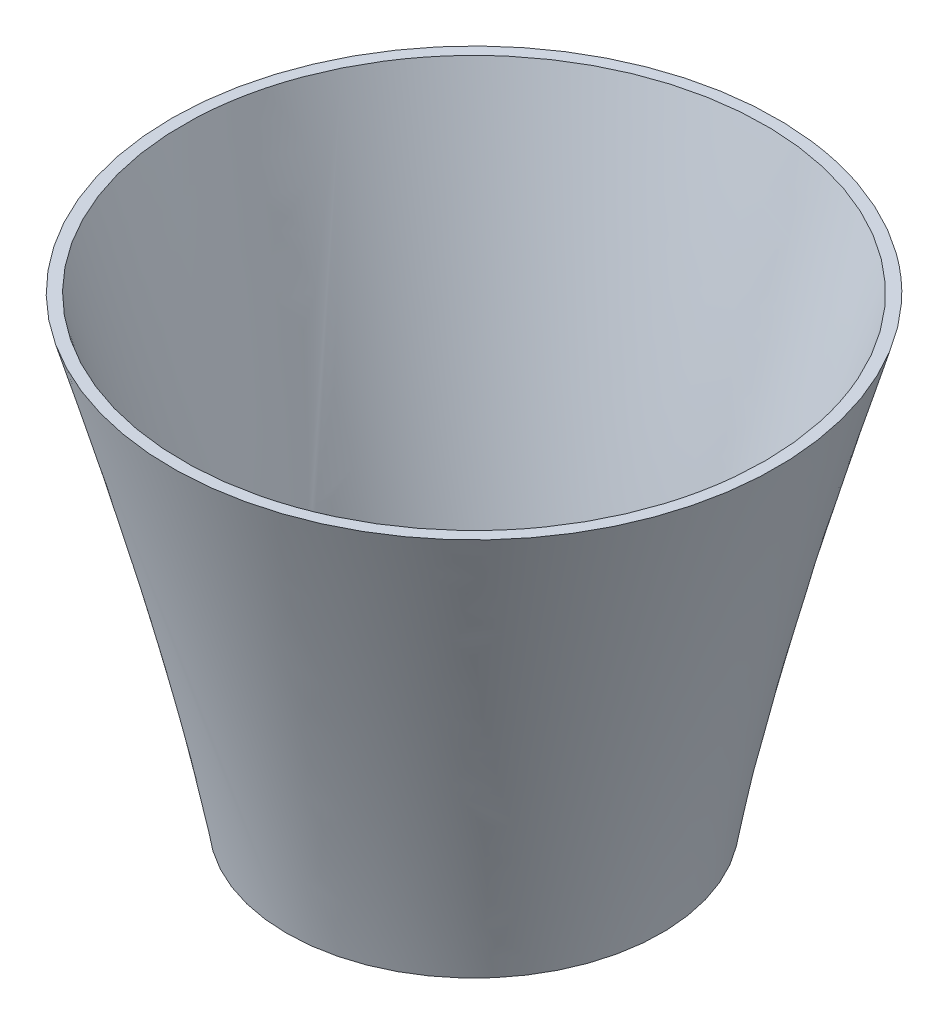
ISO-10303-21;
HEADER;
FILE_DESCRIPTION(('STEP AP214'),'2;1');
FILE_NAME('part.step','',(''),(''),'','','');
FILE_SCHEMA(('AUTOMOTIVE_DESIGN { 1 0 10303 214 1 1 1 1 }'));
ENDSEC;
DATA;
#1=APPLICATION_CONTEXT('core data for automotive mechanical design processes');
#2=APPLICATION_PROTOCOL_DEFINITION('international standard','automotive_design',2000,#1);
#3=PRODUCT_CONTEXT('',#1,'mechanical');
#4=PRODUCT('Part','Part','',(#3));
#5=PRODUCT_RELATED_PRODUCT_CATEGORY('part','',(#4));
#6=PRODUCT_DEFINITION_FORMATION('','',#4);
#7=PRODUCT_DEFINITION_CONTEXT('part definition',#1,'design');
#8=PRODUCT_DEFINITION('design','',#6,#7);
#9=PRODUCT_DEFINITION_SHAPE('','',#8);
#10=(LENGTH_UNIT() NAMED_UNIT(*) SI_UNIT(.MILLI.,.METRE.));
#11=(NAMED_UNIT(*) PLANE_ANGLE_UNIT() SI_UNIT($,.RADIAN.));
#12=(NAMED_UNIT(*) SI_UNIT($,.STERADIAN.) SOLID_ANGLE_UNIT());
#13=UNCERTAINTY_MEASURE_WITH_UNIT(LENGTH_MEASURE(1.E-05),#10,'distance_accuracy_value','');
#14=(GEOMETRIC_REPRESENTATION_CONTEXT(3) GLOBAL_UNCERTAINTY_ASSIGNED_CONTEXT((#13)) GLOBAL_UNIT_ASSIGNED_CONTEXT((#10,
#11,#12)) REPRESENTATION_CONTEXT('',''));
#15=CARTESIAN_POINT('',(0.,0.,0.));
#16=DIRECTION('',(0.,0.,1.));
#17=DIRECTION('',(1.,0.,0.));
#18=AXIS2_PLACEMENT_3D('',#15,#16,#17);
#19=CARTESIAN_POINT('',(0.,80.,0.));
#20=DIRECTION('',(0.,1.,0.));
#21=DIRECTION('',(0.,0.,1.));
#22=AXIS2_PLACEMENT_3D('',#19,#20,#21);
#23=PLANE('',#22);
#24=CARTESIAN_POINT('',(0.,80.,0.));
#25=DIRECTION('',(0.,1.,0.));
#26=DIRECTION('',(0.,0.,1.));
#27=AXIS2_PLACEMENT_3D('',#24,#25,#26);
#28=CIRCLE('',#27,50.5);
#29=CARTESIAN_POINT('',(-45.2803723576544,80.,-22.3592906674645));
#30=VERTEX_POINT('',#29);
#31=EDGE_CURVE('E115',#30,#30,#28,.T.);
#32=ORIENTED_EDGE('',*,*,#31,.F.);
#33=EDGE_LOOP('',(#32));
#34=FACE_BOUND('',#33,.T.);
#35=CARTESIAN_POINT('',(0.,80.,0.));
#36=DIRECTION('',(0.,1.,0.));
#37=DIRECTION('',(0.,0.,1.));
#38=AXIS2_PLACEMENT_3D('',#35,#36,#37);
#39=CIRCLE('',#38,52.5);
#40=CARTESIAN_POINT('',(-24.0693302255893,80.,46.6574468063945));
#41=VERTEX_POINT('',#40);
#42=EDGE_CURVE('E11',#41,#41,#39,.T.);
#43=ORIENTED_EDGE('',*,*,#42,.T.);
#44=EDGE_LOOP('',(#43));
#45=FACE_BOUND('',#44,.T.);
#46=ADVANCED_FACE('F37',(#34,#45),#23,.T.);
#47=CARTESIAN_POINT('',(0.,0.,0.));
#48=DIRECTION('',(0.,1.,0.));
#49=DIRECTION('',(0.,0.,1.));
#50=AXIS2_PLACEMENT_3D('',#47,#48,#49);
#51=PLANE('',#50);
#52=CARTESIAN_POINT('',(0.,0.,0.));
#53=DIRECTION('',(0.,1.,0.));
#54=DIRECTION('',(0.,0.,1.));
#55=AXIS2_PLACEMENT_3D('',#52,#53,#54);
#56=CIRCLE('',#55,30.5);
#57=CARTESIAN_POINT('',(-30.4996146914555,0.,0.153309075903949));
#58=VERTEX_POINT('',#57);
#59=EDGE_CURVE('E50',#58,#58,#56,.T.);
#60=ORIENTED_EDGE('',*,*,#59,.T.);
#61=EDGE_LOOP('',(#60));
#62=FACE_BOUND('',#61,.T.);
#63=CARTESIAN_POINT('',(0.,0.,0.));
#64=DIRECTION('',(0.,1.,0.));
#65=DIRECTION('',(0.,0.,1.));
#66=AXIS2_PLACEMENT_3D('',#63,#64,#65);
#67=CIRCLE('',#66,32.5);
#68=CARTESIAN_POINT('',(0.,0.,32.5));
#69=VERTEX_POINT('',#68);
#70=EDGE_CURVE('E45',#69,#69,#67,.T.);
#71=ORIENTED_EDGE('',*,*,#70,.F.);
#72=EDGE_LOOP('',(#71));
#73=FACE_BOUND('',#72,.T.);
#74=ADVANCED_FACE('F69',(#62,#73),#51,.F.);
#75=CARTESIAN_POINT('',(0.,0.,32.5));
#76=CARTESIAN_POINT('',(-24.0693302255893,80.,46.6574468063945));
#77=CARTESIAN_POINT('',(65.,0.,32.5));
#78=CARTESIAN_POINT('',(69.2455633871997,80.,94.7961072575732));
#79=CARTESIAN_POINT('',(65.,0.,-32.5));
#80=CARTESIAN_POINT('',(117.384223838378,80.,1.48121364478414));
#81=CARTESIAN_POINT('',(0.,0.,-32.5));
#82=CARTESIAN_POINT('',(24.0693302255893,80.,-46.6574468063945));
#83=CARTESIAN_POINT('',(-65.,0.,-32.5));
#84=CARTESIAN_POINT('',(-69.2455633871997,80.,-94.7961072575731));
#85=CARTESIAN_POINT('',(-65.,0.,32.5));
#86=CARTESIAN_POINT('',(-117.384223838378,80.,-1.48121364478415));
#87=CARTESIAN_POINT('',(0.,0.,32.5));
#88=CARTESIAN_POINT('',(-24.0693302255893,80.,46.6574468063945));
#89=(BOUNDED_SURFACE() B_SPLINE_SURFACE(3,1,((#75,#76),(#77,#78),(#79,#80),(#81,#82),(#83,#84),
(#85,#86),(#87,#88)),.UNSPECIFIED.,.T.,.F.,.F.) B_SPLINE_SURFACE_WITH_KNOTS((4,3,4),(2,2),(0.,
0.5,1.),(0.,1.),.UNSPECIFIED.) GEOMETRIC_REPRESENTATION_ITEM() RATIONAL_B_SPLINE_SURFACE(((1.,
1.),(0.333333333333333,0.333333333333333),(0.333333333333333,0.333333333333333),(1.,1.),
(0.333333333333333,0.333333333333333),(0.333333333333333,0.333333333333333),(1.,1.))) REPRESENTATION_ITEM('') SURFACE());
#90=CARTESIAN_POINT('',(0.,0.,32.5));
#91=CARTESIAN_POINT('',(-0.250722189849889,0.833333333333332,32.6474734042333));
#92=CARTESIAN_POINT('',(-0.501444379699778,1.66666666666667,32.7949468084666));
#93=CARTESIAN_POINT('',(-1.00288875939956,3.33333333333333,33.0898936169331));
#94=CARTESIAN_POINT('',(-1.25361094924944,4.16666666666667,33.2373670211664));
#95=CARTESIAN_POINT('',(-1.75505532894922,5.83333333333333,33.5323138296329));
#96=CARTESIAN_POINT('',(-2.00577751879911,6.66666666666667,33.6797872338662));
#97=CARTESIAN_POINT('',(-2.50722189849889,8.33333333333333,33.9747340423328));
#98=CARTESIAN_POINT('',(-2.75794408834878,9.16666666666667,34.122207446566));
#99=CARTESIAN_POINT('',(-3.25938846804855,10.8333333333333,34.4171542550326));
#100=CARTESIAN_POINT('',(-3.51011065789844,11.6666666666667,34.5646276592659));
#101=CARTESIAN_POINT('',(-4.01155503759822,13.3333333333333,34.8595744677324));
#102=CARTESIAN_POINT('',(-4.26227722744811,14.1666666666667,35.0070478719657));
#103=CARTESIAN_POINT('',(-4.76372160714789,15.8333333333333,35.3019946804322));
#104=CARTESIAN_POINT('',(-5.01444379699778,16.6666666666667,35.4494680846655));
#105=CARTESIAN_POINT('',(-5.51588817669755,18.3333333333333,35.7444148931321));
#106=CARTESIAN_POINT('',(-5.76661036654744,19.1666666666667,35.8918882973653));
#107=CARTESIAN_POINT('',(-6.26805474624722,20.8333333333333,36.1868351058319));
#108=CARTESIAN_POINT('',(-6.51877693609711,21.6666666666667,36.3343085100652));
#109=CARTESIAN_POINT('',(-7.02022131579689,23.3333333333333,36.6292553185317));
#110=CARTESIAN_POINT('',(-7.27094350564678,24.1666666666667,36.776728722765));
#111=CARTESIAN_POINT('',(-7.77238788534655,25.8333333333333,37.0716755312316));
#112=CARTESIAN_POINT('',(-8.02311007519644,26.6666666666667,37.2191489354648));
#113=CARTESIAN_POINT('',(-8.52455445489622,28.3333333333333,37.5140957439314));
#114=CARTESIAN_POINT('',(-8.77527664474611,29.1666666666667,37.6615691481647));
#115=CARTESIAN_POINT('',(-9.27672102444589,30.8333333333333,37.9565159566312));
#116=CARTESIAN_POINT('',(-9.52744321429578,31.6666666666667,38.1039893608645));
#117=CARTESIAN_POINT('',(-10.0288875939956,33.3333333333333,38.398936169331));
#118=CARTESIAN_POINT('',(-10.2796097838454,34.1666666666667,38.5464095735643));
#119=CARTESIAN_POINT('',(-10.7810541635452,35.8333333333333,38.8413563820309));
#120=CARTESIAN_POINT('',(-11.0317763533951,36.6666666666667,38.9888297862641));
#121=CARTESIAN_POINT('',(-11.5332207330949,38.3333333333333,39.2837765947307));
#122=CARTESIAN_POINT('',(-11.7839429229448,39.1666666666667,39.431249998964));
#123=CARTESIAN_POINT('',(-12.2853873026446,40.8333333333333,39.7261968074305));
#124=CARTESIAN_POINT('',(-12.5361094924944,41.6666666666667,39.8736702116638));
#125=CARTESIAN_POINT('',(-13.0375538721942,43.3333333333333,40.1686170201304));
#126=CARTESIAN_POINT('',(-13.2882760620441,44.1666666666667,40.3160904243636));
#127=CARTESIAN_POINT('',(-13.7897204417439,45.8333333333333,40.6110372328302));
#128=CARTESIAN_POINT('',(-14.0404426315938,46.6666666666667,40.7585106370635));
#129=CARTESIAN_POINT('',(-14.5418870112936,48.3333333333333,41.05345744553));
#130=CARTESIAN_POINT('',(-14.7926092011434,49.1666666666667,41.2009308497633));
#131=CARTESIAN_POINT('',(-15.2940535808432,50.8333333333333,41.4958776582298));
#132=CARTESIAN_POINT('',(-15.5447757706931,51.6666666666667,41.6433510624631));
#133=CARTESIAN_POINT('',(-16.0462201503929,53.3333333333333,41.9382978709297));
#134=CARTESIAN_POINT('',(-16.2969423402428,54.1666666666667,42.0857712751629));
#135=CARTESIAN_POINT('',(-16.7983867199426,55.8333333333333,42.3807180836295));
#136=CARTESIAN_POINT('',(-17.0491089097924,56.6666666666667,42.5281914878628));
#137=CARTESIAN_POINT('',(-17.5505532894922,58.3333333333333,42.8231382963293));
#138=CARTESIAN_POINT('',(-17.8012754793421,59.1666666666667,42.9706117005626));
#139=CARTESIAN_POINT('',(-18.3027198590419,60.8333333333333,43.2655585090291));
#140=CARTESIAN_POINT('',(-18.5534420488918,61.6666666666667,43.4130319132624));
#141=CARTESIAN_POINT('',(-19.0548864285916,63.3333333333333,43.707978721729));
#142=CARTESIAN_POINT('',(-19.3056086184414,64.1666666666667,43.8554521259623));
#143=CARTESIAN_POINT('',(-19.8070529981412,65.8333333333333,44.1503989344288));
#144=CARTESIAN_POINT('',(-20.0577751879911,66.6666666666667,44.2978723386621));
#145=CARTESIAN_POINT('',(-20.5592195676909,68.3333333333333,44.5928191471286));
#146=CARTESIAN_POINT('',(-20.8099417575408,69.1666666666667,44.7402925513619));
#147=CARTESIAN_POINT('',(-21.3113861372406,70.8333333333333,45.0352393598285));
#148=CARTESIAN_POINT('',(-21.5621083270904,71.6666666666667,45.1827127640617));
#149=CARTESIAN_POINT('',(-22.0635527067902,73.3333333333333,45.4776595725283));
#150=CARTESIAN_POINT('',(-22.3142748966401,74.1666666666667,45.6251329767616));
#151=CARTESIAN_POINT('',(-22.8157192763399,75.8333333333333,45.9200797852281));
#152=CARTESIAN_POINT('',(-23.0664414661898,76.6666666666667,46.0675531894614));
#153=CARTESIAN_POINT('',(-23.5678858458895,78.3333333333333,46.3624999979279));
#154=CARTESIAN_POINT('',(-23.8186080357394,79.1666666666667,46.5099734021612));
#155=CARTESIAN_POINT('',(-24.0693302255893,80.,46.6574468063945));
#156=B_SPLINE_CURVE_WITH_KNOTS('',3,(#90,#91,#92,#93,#94,#95,#96,#97,#98,#99,#100,#101,#102,
#103,#104,#105,#106,#107,#108,#109,#110,#111,#112,#113,#114,#115,#116,#117,#118,#119,#120,#121,
#122,#123,#124,#125,#126,#127,#128,#129,#130,#131,#132,#133,#134,#135,#136,#137,#138,#139,#140,
#141,#142,#143,#144,#145,#146,#147,#148,#149,#150,#151,#152,#153,#154,#155),.UNSPECIFIED.,.F.,
.F.,(4,2,2,2,2,2,2,2,2,2,2,2,2,2,2,2,2,2,2,2,2,2,2,2,2,2,2,2,2,2,2,2,4),(0.,2.64792186307555,
5.29584372615109,7.94376558922664,10.5916874523022,13.2396093153777,15.8875311784533,
18.5354530415288,21.1833749046044,23.8312967676799,26.4792186307555,29.127140493831,
31.7750623569066,34.4229842199821,37.0709060830577,39.7188279461332,42.3667498092087,
45.0146716722843,47.6625935353598,50.3105153984354,52.9584372615109,55.6063591245865,
58.254280987662,60.9022028507376,63.5501247138131,66.1980465768886,68.8459684399642,
71.4938903030397,74.1418121661153,76.7897340291908,79.4376558922664,82.0855777553419,
84.7334996184175),.UNSPECIFIED.);
#157=EDGE_CURVE('BSEAM78',#69,#41,#156,.T.);
#158=ORIENTED_EDGE('',*,*,#70,.T.);
#159=ORIENTED_EDGE('',*,*,#42,.F.);
#160=ORIENTED_EDGE('',*,*,#157,.T.);
#161=ORIENTED_EDGE('',*,*,#157,.F.);
#162=EDGE_LOOP('',(#158,#160,#159,#161));
#163=FACE_BOUND('',#162,.T.);
#164=ADVANCED_FACE('F78',(#163),#89,.T.);
#165=CARTESIAN_POINT('',(-45.2803723576544,80.,-22.3592906674645));
#166=CARTESIAN_POINT('',(-30.4996146914555,0.,0.153309075903949));
#167=CARTESIAN_POINT('',(-0.561791022725355,80.,-112.920035382773));
#168=CARTESIAN_POINT('',(-30.8062328432634,0.,-60.8459203070069));
#169=CARTESIAN_POINT('',(89.9989536925835,80.,-68.2014540478443));
#170=CARTESIAN_POINT('',(30.1929965396475,0.,-61.1525384588149));
#171=CARTESIAN_POINT('',(45.2803723576544,80.,22.3592906674645));
#172=CARTESIAN_POINT('',(30.4996146914555,0.,-0.153309075903953));
#173=CARTESIAN_POINT('',(0.561791022725362,80.,112.920035382773));
#174=CARTESIAN_POINT('',(30.8062328432634,0.,60.8459203070069));
#175=CARTESIAN_POINT('',(-89.9989536925835,80.,68.2014540478443));
#176=CARTESIAN_POINT('',(-30.1929965396475,0.,61.1525384588148));
#177=CARTESIAN_POINT('',(-45.2803723576544,80.,-22.3592906674645));
#178=CARTESIAN_POINT('',(-30.4996146914555,0.,0.153309075903949));
#179=(BOUNDED_SURFACE() B_SPLINE_SURFACE(3,1,((#165,#166),(#167,#168),(#169,#170),(#171,#172),
(#173,#174),(#175,#176),(#177,#178)),.UNSPECIFIED.,.T.,.F.,.F.) B_SPLINE_SURFACE_WITH_KNOTS((4,
3,4),(2,2),(0.,0.5,1.),(0.,1.),
.UNSPECIFIED.) GEOMETRIC_REPRESENTATION_ITEM() RATIONAL_B_SPLINE_SURFACE(((1.,1.),
(0.333333333333333,0.333333333333333),(0.333333333333333,0.333333333333333),(1.,1.),
(0.333333333333333,0.333333333333334),(0.333333333333333,0.333333333333334),(1.,1.))) REPRESENTATION_ITEM('') SURFACE());
#180=CARTESIAN_POINT('',(-45.2803723576544,80.,-22.3592906674645));
#181=CARTESIAN_POINT('',(-45.1264061319648,79.1666666666667,-22.1247844201378));
#182=CARTESIAN_POINT('',(-44.9724399062753,78.3333333333333,-21.890278172811));
#183=CARTESIAN_POINT('',(-44.6645074548961,76.6666666666667,-21.4212656781575));
#184=CARTESIAN_POINT('',(-44.5105412292066,75.8333333333333,-21.1867594308308));
#185=CARTESIAN_POINT('',(-44.2026087778274,74.1666666666667,-20.7177469361772));
#186=CARTESIAN_POINT('',(-44.0486425521378,73.3333333333333,-20.4832406888505));
#187=CARTESIAN_POINT('',(-43.7407101007587,71.6666666666667,-20.014228194197));
#188=CARTESIAN_POINT('',(-43.5867438750691,70.8333333333333,-19.7797219468702));
#189=CARTESIAN_POINT('',(-43.27881142369,69.1666666666667,-19.3107094522167));
#190=CARTESIAN_POINT('',(-43.1248451980004,68.3333333333333,-19.07620320489));
#191=CARTESIAN_POINT('',(-42.8169127466212,66.6666666666667,-18.6071907102365));
#192=CARTESIAN_POINT('',(-42.6629465209317,65.8333333333333,-18.3726844629097));
#193=CARTESIAN_POINT('',(-42.3550140695525,64.1666666666667,-17.9036719682562));
#194=CARTESIAN_POINT('',(-42.201047843863,63.3333333333333,-17.6691657209294));
#195=CARTESIAN_POINT('',(-41.8931153924838,61.6666666666667,-17.2001532262759));
#196=CARTESIAN_POINT('',(-41.7391491667942,60.8333333333333,-16.9656469789492));
#197=CARTESIAN_POINT('',(-41.4312167154151,59.1666666666667,-16.4966344842957));
#198=CARTESIAN_POINT('',(-41.2772504897255,58.3333333333333,-16.2621282369689));
#199=CARTESIAN_POINT('',(-40.9693180383464,56.6666666666667,-15.7931157423154));
#200=CARTESIAN_POINT('',(-40.8153518126568,55.8333333333333,-15.5586094949886));
#201=CARTESIAN_POINT('',(-40.5074193612777,54.1666666666667,-15.0895970003351));
#202=CARTESIAN_POINT('',(-40.3534531355881,53.3333333333333,-14.8550907530084));
#203=CARTESIAN_POINT('',(-40.0455206842089,51.6666666666667,-14.3860782583549));
#204=CARTESIAN_POINT('',(-39.8915544585194,50.8333333333333,-14.1515720110281));
#205=CARTESIAN_POINT('',(-39.5836220071402,49.1666666666667,-13.6825595163746));
#206=CARTESIAN_POINT('',(-39.4296557814507,48.3333333333333,-13.4480532690478));
#207=CARTESIAN_POINT('',(-39.1217233300715,46.6666666666667,-12.9790407743943));
#208=CARTESIAN_POINT('',(-38.9677571043819,45.8333333333333,-12.7445345270676));
#209=CARTESIAN_POINT('',(-38.6598246530028,44.1666666666667,-12.2755220324141));
#210=CARTESIAN_POINT('',(-38.5058584273132,43.3333333333333,-12.0410157850873));
#211=CARTESIAN_POINT('',(-38.1979259759341,41.6666666666667,-11.5720032904338));
#212=CARTESIAN_POINT('',(-38.0439597502445,40.8333333333333,-11.337497043107));
#213=CARTESIAN_POINT('',(-37.7360272988654,39.1666666666667,-10.8684845484535));
#214=CARTESIAN_POINT('',(-37.5820610731758,38.3333333333333,-10.6339783011268));
#215=CARTESIAN_POINT('',(-37.2741286217966,36.6666666666667,-10.1649658064733));
#216=CARTESIAN_POINT('',(-37.1201623961071,35.8333333333333,-9.93045955914652));
#217=CARTESIAN_POINT('',(-36.8122299447279,34.1666666666667,-9.46144706449301));
#218=CARTESIAN_POINT('',(-36.6582637190384,33.3333333333333,-9.22694081716625));
#219=CARTESIAN_POINT('',(-36.3503312676592,31.6666666666667,-8.75792832251274));
#220=CARTESIAN_POINT('',(-36.1963650419696,30.8333333333333,-8.52342207518599));
#221=CARTESIAN_POINT('',(-35.8884325905905,29.1666666666667,-8.05440958053248));
#222=CARTESIAN_POINT('',(-35.7344663649009,28.3333333333333,-7.81990333320572));
#223=CARTESIAN_POINT('',(-35.4265339135218,26.6666666666667,-7.35089083855221));
#224=CARTESIAN_POINT('',(-35.2725676878322,25.8333333333333,-7.11638459122546));
#225=CARTESIAN_POINT('',(-34.9646352364531,24.1666666666667,-6.64737209657195));
#226=CARTESIAN_POINT('',(-34.8106690107635,23.3333333333333,-6.41286584924519));
#227=CARTESIAN_POINT('',(-34.5027365593843,21.6666666666667,-5.94385335459168));
#228=CARTESIAN_POINT('',(-34.3487703336948,20.8333333333333,-5.70934710726493));
#229=CARTESIAN_POINT('',(-34.0408378823156,19.1666666666667,-5.24033461261142));
#230=CARTESIAN_POINT('',(-33.886871656626,18.3333333333333,-5.00582836528466));
#231=CARTESIAN_POINT('',(-33.5789392052469,16.6666666666667,-4.53681587063115));
#232=CARTESIAN_POINT('',(-33.4249729795573,15.8333333333333,-4.3023096233044));
#233=CARTESIAN_POINT('',(-33.1170405281782,14.1666666666667,-3.83329712865089));
#234=CARTESIAN_POINT('',(-32.9630743024886,13.3333333333333,-3.59879088132413));
#235=CARTESIAN_POINT('',(-32.6551418511095,11.6666666666667,-3.12977838667062));
#236=CARTESIAN_POINT('',(-32.5011756254199,10.8333333333333,-2.89527213934387));
#237=CARTESIAN_POINT('',(-32.1932431740407,9.16666666666667,-2.42625964469036));
#238=CARTESIAN_POINT('',(-32.0392769483512,8.33333333333333,-2.1917533973636));
#239=CARTESIAN_POINT('',(-31.731344496972,6.66666666666667,-1.72274090271009));
#240=CARTESIAN_POINT('',(-31.5773782712825,5.83333333333333,-1.48823465538334));
#241=CARTESIAN_POINT('',(-31.2694458199033,4.16666666666667,-1.01922216072983));
#242=CARTESIAN_POINT('',(-31.1154795942137,3.33333333333333,-0.78471591340307));
#243=CARTESIAN_POINT('',(-30.8075471428346,1.66666666666667,-0.315703418749561));
#244=CARTESIAN_POINT('',(-30.653580917145,0.833333333333335,-0.0811971714228064));
#245=CARTESIAN_POINT('',(-30.4996146914555,0.,0.153309075903949));
#246=B_SPLINE_CURVE_WITH_KNOTS('',3,(#180,#181,#182,#183,#184,#185,#186,#187,#188,#189,#190,
#191,#192,#193,#194,#195,#196,#197,#198,#199,#200,#201,#202,#203,#204,#205,#206,#207,#208,#209,
#210,#211,#212,#213,#214,#215,#216,#217,#218,#219,#220,#221,#222,#223,#224,#225,#226,#227,#228,
#229,#230,#231,#232,#233,#234,#235,#236,#237,#238,#239,#240,#241,#242,#243,#244,#245),
.UNSPECIFIED.,.F.,.F.,(4,2,2,2,2,2,2,2,2,2,2,2,2,2,2,2,2,2,2,2,2,2,2,2,2,2,2,2,2,2,2,2,4),(0.,
2.63785689683791,5.27571379367582,7.91357069051374,10.5514275873516,13.1892844841895,
15.8271413810275,18.4649982778654,21.1028551747033,23.7407120715412,26.3785689683791,
29.016425865217,31.6542827620549,34.2921396588928,36.9299965557307,39.5678534525686,
42.2057103494066,44.8435672462445,47.4814241430824,50.1192810399203,52.7571379367582,
55.3949948335961,58.032851730434,60.6707086272719,63.3085655241098,65.9464224209477,
68.5842793177856,71.2221362146235,73.8599931114615,76.4978500082994,79.1357069051373,
81.7735638019752,84.4114206988131),.UNSPECIFIED.);
#247=EDGE_CURVE('BSEAM80',#30,#58,#246,.T.);
#248=ORIENTED_EDGE('',*,*,#31,.T.);
#249=ORIENTED_EDGE('',*,*,#59,.F.);
#250=ORIENTED_EDGE('',*,*,#247,.T.);
#251=ORIENTED_EDGE('',*,*,#247,.F.);
#252=EDGE_LOOP('',(#248,#250,#249,#251));
#253=FACE_BOUND('',#252,.T.);
#254=ADVANCED_FACE('F80',(#253),#179,.F.);
#255=CLOSED_SHELL('',(#46,#74,#164,#254));
#256=MANIFOLD_SOLID_BREP('B2',#255);
#257=ADVANCED_BREP_SHAPE_REPRESENTATION('',(#18,#256),#14);
#258=SHAPE_DEFINITION_REPRESENTATION(#9,#257);
ENDSEC;
END-ISO-10303-21;
